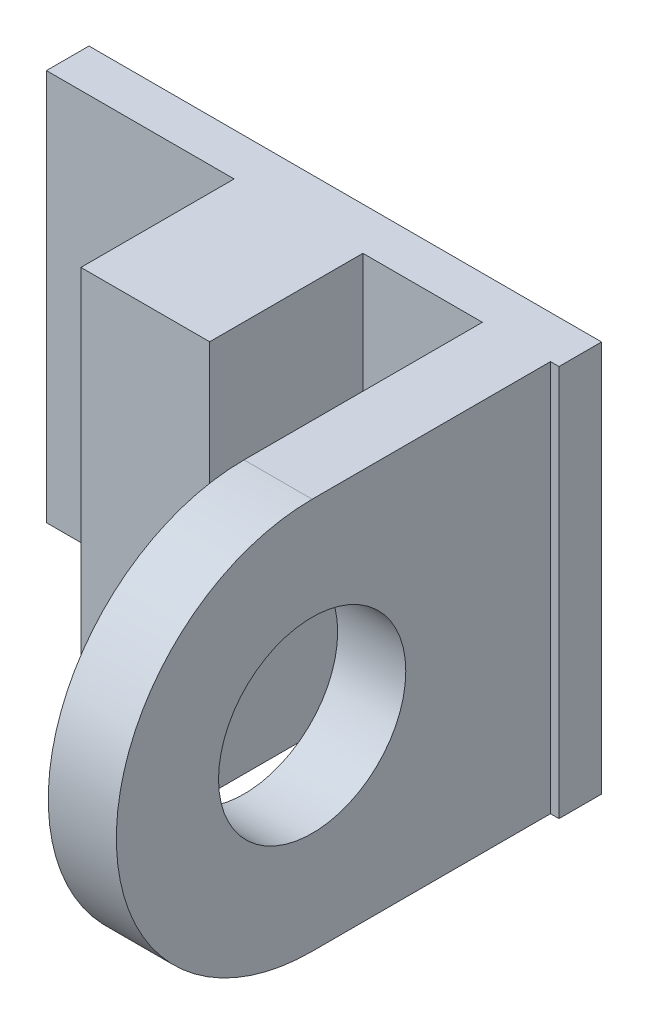
ISO-10303-21;
HEADER;
FILE_DESCRIPTION(('STEP AP214'),'2;1');
FILE_NAME('part.step','',(''),(''),'','','');
FILE_SCHEMA(('AUTOMOTIVE_DESIGN { 1 0 10303 214 1 1 1 1 }'));
ENDSEC;
DATA;
#1=APPLICATION_CONTEXT('core data for automotive mechanical design processes');
#2=APPLICATION_PROTOCOL_DEFINITION('international standard','automotive_design',2000,#1);
#3=PRODUCT_CONTEXT('',#1,'mechanical');
#4=PRODUCT('Part','Part','',(#3));
#5=PRODUCT_RELATED_PRODUCT_CATEGORY('part','',(#4));
#6=PRODUCT_DEFINITION_FORMATION('','',#4);
#7=PRODUCT_DEFINITION_CONTEXT('part definition',#1,'design');
#8=PRODUCT_DEFINITION('design','',#6,#7);
#9=PRODUCT_DEFINITION_SHAPE('','',#8);
#10=(LENGTH_UNIT() NAMED_UNIT(*) SI_UNIT(.MILLI.,.METRE.));
#11=(NAMED_UNIT(*) PLANE_ANGLE_UNIT() SI_UNIT($,.RADIAN.));
#12=(NAMED_UNIT(*) SI_UNIT($,.STERADIAN.) SOLID_ANGLE_UNIT());
#13=UNCERTAINTY_MEASURE_WITH_UNIT(LENGTH_MEASURE(1.E-05),#10,'distance_accuracy_value','');
#14=(GEOMETRIC_REPRESENTATION_CONTEXT(3) GLOBAL_UNCERTAINTY_ASSIGNED_CONTEXT((#13)) GLOBAL_UNIT_ASSIGNED_CONTEXT((#10,
#11,#12)) REPRESENTATION_CONTEXT('',''));
#15=CARTESIAN_POINT('',(0.,0.,0.));
#16=DIRECTION('',(0.,0.,1.));
#17=DIRECTION('',(1.,0.,0.));
#18=AXIS2_PLACEMENT_3D('',#15,#16,#17);
#19=CARTESIAN_POINT('',(0.,0.,5.));
#20=DIRECTION('',(0.,0.,-1.));
#21=DIRECTION('',(-1.,0.,0.));
#22=AXIS2_PLACEMENT_3D('',#19,#20,#21);
#23=PLANE('',#22);
#24=DIRECTION('',(0.,1.,0.));
#25=VECTOR('',#24,1.);
#26=CARTESIAN_POINT('',(13.,-23.,5.));
#27=LINE('',#26,#25);
#28=CARTESIAN_POINT('',(13.,-23.,5.));
#29=VERTEX_POINT('',#28);
#30=CARTESIAN_POINT('',(13.,23.,5.));
#31=VERTEX_POINT('',#30);
#32=EDGE_CURVE('E172',#29,#31,#27,.T.);
#33=ORIENTED_EDGE('',*,*,#32,.F.);
#34=DIRECTION('',(1.,0.,0.));
#35=VECTOR('',#34,1.);
#36=CARTESIAN_POINT('',(-46.2139933235213,-23.,5.));
#37=LINE('',#36,#35);
#38=CARTESIAN_POINT('',(14.,-23.,5.));
#39=VERTEX_POINT('',#38);
#40=EDGE_CURVE('E205',#29,#39,#37,.T.);
#41=ORIENTED_EDGE('',*,*,#40,.T.);
#42=DIRECTION('',(0.,1.,0.));
#43=VECTOR('',#42,1.);
#44=CARTESIAN_POINT('',(14.,-23.,5.));
#45=LINE('',#44,#43);
#46=CARTESIAN_POINT('',(14.,23.,5.));
#47=VERTEX_POINT('',#46);
#48=EDGE_CURVE('E198',#39,#47,#45,.T.);
#49=ORIENTED_EDGE('',*,*,#48,.T.);
#50=DIRECTION('',(-1.,0.,0.));
#51=VECTOR('',#50,1.);
#52=CARTESIAN_POINT('',(-46.2139933235213,23.,5.));
#53=LINE('',#52,#51);
#54=EDGE_CURVE('E56',#47,#31,#53,.T.);
#55=ORIENTED_EDGE('',*,*,#54,.T.);
#56=EDGE_LOOP('',(#33,#41,#49,#55));
#57=FACE_BOUND('',#56,.T.);
#58=ADVANCED_FACE('F33',(#57),#23,.F.);
#59=DIRECTION('',(0.,-1.,0.));
#60=VECTOR('',#59,1.);
#61=CARTESIAN_POINT('',(5.,-23.,5.));
#62=LINE('',#61,#60);
#63=CARTESIAN_POINT('',(5.,23.,5.));
#64=VERTEX_POINT('',#63);
#65=CARTESIAN_POINT('',(5.,-23.,5.));
#66=VERTEX_POINT('',#65);
#67=EDGE_CURVE('E48',#64,#66,#62,.T.);
#68=ORIENTED_EDGE('',*,*,#67,.F.);
#69=CARTESIAN_POINT('',(-9.03790020483503,23.,5.));
#70=VERTEX_POINT('',#69);
#71=EDGE_CURVE('E203',#64,#70,#53,.T.);
#72=ORIENTED_EDGE('',*,*,#71,.T.);
#73=DIRECTION('',(0.,1.,0.));
#74=VECTOR('',#73,1.);
#75=CARTESIAN_POINT('',(-9.03790020483503,-23.,5.));
#76=LINE('',#75,#74);
#77=CARTESIAN_POINT('',(-9.03790020483503,-23.,5.));
#78=VERTEX_POINT('',#77);
#79=EDGE_CURVE('E187',#78,#70,#76,.T.);
#80=ORIENTED_EDGE('',*,*,#79,.F.);
#81=EDGE_CURVE('E209',#78,#66,#37,.T.);
#82=ORIENTED_EDGE('',*,*,#81,.T.);
#83=EDGE_LOOP('',(#68,#72,#80,#82));
#84=FACE_BOUND('',#83,.T.);
#85=ADVANCED_FACE('F239',(#84),#23,.F.);
#86=DIRECTION('',(0.,-1.,0.));
#87=VECTOR('',#86,1.);
#88=CARTESIAN_POINT('',(-24.1641293147936,-23.,5.));
#89=LINE('',#88,#87);
#90=CARTESIAN_POINT('',(-24.1641293147936,23.,5.));
#91=VERTEX_POINT('',#90);
#92=CARTESIAN_POINT('',(-24.1641293147936,-23.,5.));
#93=VERTEX_POINT('',#92);
#94=EDGE_CURVE('E190',#91,#93,#89,.T.);
#95=ORIENTED_EDGE('',*,*,#94,.F.);
#96=CARTESIAN_POINT('',(-46.2139933235213,23.,5.));
#97=VERTEX_POINT('',#96);
#98=EDGE_CURVE('E130',#91,#97,#53,.T.);
#99=ORIENTED_EDGE('',*,*,#98,.T.);
#100=DIRECTION('',(0.,-1.,0.));
#101=VECTOR('',#100,1.);
#102=CARTESIAN_POINT('',(-46.2139933235213,-23.,5.));
#103=LINE('',#102,#101);
#104=CARTESIAN_POINT('',(-46.2139933235213,-23.,5.));
#105=VERTEX_POINT('',#104);
#106=EDGE_CURVE('E202',#97,#105,#103,.T.);
#107=ORIENTED_EDGE('',*,*,#106,.T.);
#108=EDGE_CURVE('E206',#105,#93,#37,.T.);
#109=ORIENTED_EDGE('',*,*,#108,.T.);
#110=EDGE_LOOP('',(#95,#99,#107,#109));
#111=FACE_BOUND('',#110,.T.);
#112=ADVANCED_FACE('F250',(#111),#23,.F.);
#113=CARTESIAN_POINT('',(14.,-23.,5.));
#114=DIRECTION('',(-1.,0.,0.));
#115=DIRECTION('',(0.,-1.,0.));
#116=AXIS2_PLACEMENT_3D('',#113,#114,#115);
#117=PLANE('',#116);
#118=DIRECTION('',(0.,1.,0.));
#119=VECTOR('',#118,1.);
#120=CARTESIAN_POINT('',(14.,-23.,0.));
#121=LINE('',#120,#119);
#122=CARTESIAN_POINT('',(14.,-23.,0.));
#123=VERTEX_POINT('',#122);
#124=CARTESIAN_POINT('',(14.,23.,0.));
#125=VERTEX_POINT('',#124);
#126=EDGE_CURVE('E197',#123,#125,#121,.T.);
#127=ORIENTED_EDGE('',*,*,#126,.T.);
#128=DIRECTION('',(0.,0.,-1.));
#129=VECTOR('',#128,1.);
#130=CARTESIAN_POINT('',(14.,23.,5.));
#131=LINE('',#130,#129);
#132=EDGE_CURVE('E11',#47,#125,#131,.T.);
#133=ORIENTED_EDGE('',*,*,#132,.F.);
#134=ORIENTED_EDGE('',*,*,#48,.F.);
#135=DIRECTION('',(0.,0.,-1.));
#136=VECTOR('',#135,1.);
#137=CARTESIAN_POINT('',(14.,-23.,5.));
#138=LINE('',#137,#136);
#139=EDGE_CURVE('E208',#39,#123,#138,.T.);
#140=ORIENTED_EDGE('',*,*,#139,.T.);
#141=EDGE_LOOP('',(#127,#133,#134,#140));
#142=FACE_BOUND('',#141,.T.);
#143=ADVANCED_FACE('F35',(#142),#117,.F.);
#144=CARTESIAN_POINT('',(-46.2139933235213,23.,5.));
#145=DIRECTION('',(0.,-1.,0.));
#146=DIRECTION('',(0.,0.,-1.));
#147=AXIS2_PLACEMENT_3D('',#144,#145,#146);
#148=PLANE('',#147);
#149=DIRECTION('',(-1.,0.,0.));
#150=VECTOR('',#149,1.);
#151=CARTESIAN_POINT('',(-46.2139933235213,23.,0.));
#152=LINE('',#151,#150);
#153=CARTESIAN_POINT('',(-46.2139933235213,23.,0.));
#154=VERTEX_POINT('',#153);
#155=EDGE_CURVE('E212',#125,#154,#152,.T.);
#156=ORIENTED_EDGE('',*,*,#155,.T.);
#157=DIRECTION('',(0.,0.,-1.));
#158=VECTOR('',#157,1.);
#159=CARTESIAN_POINT('',(-46.2139933235213,23.,5.));
#160=LINE('',#159,#158);
#161=EDGE_CURVE('E41',#97,#154,#160,.T.);
#162=ORIENTED_EDGE('',*,*,#161,.F.);
#163=ORIENTED_EDGE('',*,*,#98,.F.);
#164=DIRECTION('',(0.,0.,-1.));
#165=VECTOR('',#164,1.);
#166=CARTESIAN_POINT('',(-24.1641293147936,23.,11.));
#167=LINE('',#166,#165);
#168=CARTESIAN_POINT('',(-24.1641293147936,23.,23.));
#169=VERTEX_POINT('',#168);
#170=EDGE_CURVE('E124',#169,#91,#167,.T.);
#171=ORIENTED_EDGE('',*,*,#170,.F.);
#172=DIRECTION('',(-1.,0.,0.));
#173=VECTOR('',#172,1.);
#174=CARTESIAN_POINT('',(38.5015570911838,23.,23.));
#175=LINE('',#174,#173);
#176=CARTESIAN_POINT('',(-9.03790020483503,23.,23.));
#177=VERTEX_POINT('',#176);
#178=EDGE_CURVE('E128',#177,#169,#175,.T.);
#179=ORIENTED_EDGE('',*,*,#178,.F.);
#180=DIRECTION('',(0.,0.,-1.));
#181=VECTOR('',#180,1.);
#182=CARTESIAN_POINT('',(-9.03790020483503,23.,11.));
#183=LINE('',#182,#181);
#184=EDGE_CURVE('E134',#177,#70,#183,.T.);
#185=ORIENTED_EDGE('',*,*,#184,.T.);
#186=ORIENTED_EDGE('',*,*,#71,.F.);
#187=DIRECTION('',(0.,0.,-1.));
#188=VECTOR('',#187,1.);
#189=CARTESIAN_POINT('',(5.,23.,11.));
#190=LINE('',#189,#188);
#191=CARTESIAN_POINT('',(5.,23.,33.));
#192=VERTEX_POINT('',#191);
#193=EDGE_CURVE('E182',#192,#64,#190,.T.);
#194=ORIENTED_EDGE('',*,*,#193,.F.);
#195=DIRECTION('',(-1.,0.,0.));
#196=VECTOR('',#195,1.);
#197=CARTESIAN_POINT('',(77.3506021727847,23.,33.));
#198=LINE('',#197,#196);
#199=CARTESIAN_POINT('',(13.,23.,33.));
#200=VERTEX_POINT('',#199);
#201=EDGE_CURVE('E158',#200,#192,#198,.T.);
#202=ORIENTED_EDGE('',*,*,#201,.F.);
#203=DIRECTION('',(0.,0.,-1.));
#204=VECTOR('',#203,1.);
#205=CARTESIAN_POINT('',(13.,23.,11.));
#206=LINE('',#205,#204);
#207=EDGE_CURVE('E185',#200,#31,#206,.T.);
#208=ORIENTED_EDGE('',*,*,#207,.T.);
#209=ORIENTED_EDGE('',*,*,#54,.F.);
#210=ORIENTED_EDGE('',*,*,#132,.T.);
#211=EDGE_LOOP('',(#156,#162,#163,#171,#179,#185,#186,#194,#202,#208,#209,#210));
#212=FACE_BOUND('',#211,.T.);
#213=ADVANCED_FACE('F126',(#212),#148,.F.);
#214=CARTESIAN_POINT('',(-46.2139933235213,-23.,5.));
#215=DIRECTION('',(1.,0.,0.));
#216=DIRECTION('',(0.,0.,-1.));
#217=AXIS2_PLACEMENT_3D('',#214,#215,#216);
#218=PLANE('',#217);
#219=DIRECTION('',(0.,-1.,0.));
#220=VECTOR('',#219,1.);
#221=CARTESIAN_POINT('',(-46.2139933235213,-23.,0.));
#222=LINE('',#221,#220);
#223=CARTESIAN_POINT('',(-46.2139933235213,-23.,0.));
#224=VERTEX_POINT('',#223);
#225=EDGE_CURVE('E214',#154,#224,#222,.T.);
#226=ORIENTED_EDGE('',*,*,#225,.T.);
#227=DIRECTION('',(0.,0.,-1.));
#228=VECTOR('',#227,1.);
#229=CARTESIAN_POINT('',(-46.2139933235213,-23.,5.));
#230=LINE('',#229,#228);
#231=EDGE_CURVE('E219',#105,#224,#230,.T.);
#232=ORIENTED_EDGE('',*,*,#231,.F.);
#233=ORIENTED_EDGE('',*,*,#106,.F.);
#234=ORIENTED_EDGE('',*,*,#161,.T.);
#235=EDGE_LOOP('',(#226,#232,#233,#234));
#236=FACE_BOUND('',#235,.T.);
#237=ADVANCED_FACE('F225',(#236),#218,.F.);
#238=CARTESIAN_POINT('',(-46.2139933235213,-23.,5.));
#239=DIRECTION('',(0.,1.,0.));
#240=DIRECTION('',(0.,0.,1.));
#241=AXIS2_PLACEMENT_3D('',#238,#239,#240);
#242=PLANE('',#241);
#243=DIRECTION('',(1.,0.,0.));
#244=VECTOR('',#243,1.);
#245=CARTESIAN_POINT('',(-46.2139933235213,-23.,0.));
#246=LINE('',#245,#244);
#247=EDGE_CURVE('E200',#224,#123,#246,.T.);
#248=ORIENTED_EDGE('',*,*,#247,.T.);
#249=ORIENTED_EDGE('',*,*,#139,.F.);
#250=ORIENTED_EDGE('',*,*,#40,.F.);
#251=DIRECTION('',(0.,0.,-1.));
#252=VECTOR('',#251,1.);
#253=CARTESIAN_POINT('',(13.,-23.,11.));
#254=LINE('',#253,#252);
#255=CARTESIAN_POINT('',(13.,-23.,33.));
#256=VERTEX_POINT('',#255);
#257=EDGE_CURVE('E176',#256,#29,#254,.T.);
#258=ORIENTED_EDGE('',*,*,#257,.F.);
#259=DIRECTION('',(-1.,0.,0.));
#260=VECTOR('',#259,1.);
#261=CARTESIAN_POINT('',(77.3506021727847,-23.,33.));
#262=LINE('',#261,#260);
#263=CARTESIAN_POINT('',(5.,-23.,33.));
#264=VERTEX_POINT('',#263);
#265=EDGE_CURVE('E165',#256,#264,#262,.T.);
#266=ORIENTED_EDGE('',*,*,#265,.T.);
#267=DIRECTION('',(0.,0.,-1.));
#268=VECTOR('',#267,1.);
#269=CARTESIAN_POINT('',(5.,-23.,11.));
#270=LINE('',#269,#268);
#271=EDGE_CURVE('E179',#264,#66,#270,.T.);
#272=ORIENTED_EDGE('',*,*,#271,.T.);
#273=ORIENTED_EDGE('',*,*,#81,.F.);
#274=DIRECTION('',(0.,0.,-1.));
#275=VECTOR('',#274,1.);
#276=CARTESIAN_POINT('',(-9.03790020483503,-23.,11.));
#277=LINE('',#276,#275);
#278=CARTESIAN_POINT('',(-9.03790020483503,-23.,23.));
#279=VERTEX_POINT('',#278);
#280=EDGE_CURVE('E192',#279,#78,#277,.T.);
#281=ORIENTED_EDGE('',*,*,#280,.F.);
#282=DIRECTION('',(-1.,0.,0.));
#283=VECTOR('',#282,1.);
#284=CARTESIAN_POINT('',(38.5015570911838,-23.,23.));
#285=LINE('',#284,#283);
#286=CARTESIAN_POINT('',(-24.1641293147936,-23.,23.));
#287=VERTEX_POINT('',#286);
#288=EDGE_CURVE('E145',#279,#287,#285,.T.);
#289=ORIENTED_EDGE('',*,*,#288,.T.);
#290=DIRECTION('',(0.,0.,-1.));
#291=VECTOR('',#290,1.);
#292=CARTESIAN_POINT('',(-24.1641293147936,-23.,11.));
#293=LINE('',#292,#291);
#294=EDGE_CURVE('E135',#287,#93,#293,.T.);
#295=ORIENTED_EDGE('',*,*,#294,.T.);
#296=ORIENTED_EDGE('',*,*,#108,.F.);
#297=ORIENTED_EDGE('',*,*,#231,.T.);
#298=EDGE_LOOP('',(#248,#249,#250,#258,#266,#272,#273,#281,#289,#295,#296,#297));
#299=FACE_BOUND('',#298,.T.);
#300=ADVANCED_FACE('F233',(#299),#242,.F.);
#301=CARTESIAN_POINT('',(0.,0.,0.));
#302=DIRECTION('',(0.,0.,-1.));
#303=DIRECTION('',(-1.,0.,0.));
#304=AXIS2_PLACEMENT_3D('',#301,#302,#303);
#305=PLANE('',#304);
#306=ORIENTED_EDGE('',*,*,#126,.F.);
#307=ORIENTED_EDGE('',*,*,#247,.F.);
#308=ORIENTED_EDGE('',*,*,#225,.F.);
#309=ORIENTED_EDGE('',*,*,#155,.F.);
#310=EDGE_LOOP('',(#306,#307,#308,#309));
#311=FACE_BOUND('',#310,.T.);
#312=ADVANCED_FACE('F230',(#311),#305,.T.);
#313=CARTESIAN_POINT('',(-9.03790020483503,-23.,11.));
#314=DIRECTION('',(-1.,0.,0.));
#315=DIRECTION('',(0.,0.,1.));
#316=AXIS2_PLACEMENT_3D('',#313,#314,#315);
#317=PLANE('',#316);
#318=ORIENTED_EDGE('',*,*,#79,.T.);
#319=ORIENTED_EDGE('',*,*,#184,.F.);
#320=DIRECTION('',(0.,1.,0.));
#321=VECTOR('',#320,1.);
#322=CARTESIAN_POINT('',(-9.03790020483503,23.,23.));
#323=LINE('',#322,#321);
#324=EDGE_CURVE('E144',#279,#177,#323,.T.);
#325=ORIENTED_EDGE('',*,*,#324,.F.);
#326=ORIENTED_EDGE('',*,*,#280,.T.);
#327=EDGE_LOOP('',(#318,#319,#325,#326));
#328=FACE_BOUND('',#327,.T.);
#329=ADVANCED_FACE('F252',(#328),#317,.F.);
#330=CARTESIAN_POINT('',(-24.1641293147936,-23.,11.));
#331=DIRECTION('',(1.,0.,0.));
#332=DIRECTION('',(0.,0.,-1.));
#333=AXIS2_PLACEMENT_3D('',#330,#331,#332);
#334=PLANE('',#333);
#335=ORIENTED_EDGE('',*,*,#94,.T.);
#336=ORIENTED_EDGE('',*,*,#294,.F.);
#337=DIRECTION('',(0.,-1.,0.));
#338=VECTOR('',#337,1.);
#339=CARTESIAN_POINT('',(-24.1641293147936,23.,23.));
#340=LINE('',#339,#338);
#341=EDGE_CURVE('E142',#169,#287,#340,.T.);
#342=ORIENTED_EDGE('',*,*,#341,.F.);
#343=ORIENTED_EDGE('',*,*,#170,.T.);
#344=EDGE_LOOP('',(#335,#336,#342,#343));
#345=FACE_BOUND('',#344,.T.);
#346=ADVANCED_FACE('F147',(#345),#334,.F.);
#347=CARTESIAN_POINT('',(13.,-23.,11.));
#348=DIRECTION('',(-1.,0.,0.));
#349=DIRECTION('',(0.,0.,1.));
#350=AXIS2_PLACEMENT_3D('',#347,#348,#349);
#351=PLANE('',#350);
#352=ORIENTED_EDGE('',*,*,#32,.T.);
#353=ORIENTED_EDGE('',*,*,#207,.F.);
#354=CARTESIAN_POINT('',(13.,0.,33.));
#355=DIRECTION('',(-1.,0.,0.));
#356=DIRECTION('',(0.,0.,1.));
#357=AXIS2_PLACEMENT_3D('',#354,#355,#356);
#358=CIRCLE('',#357,23.);
#359=EDGE_CURVE('E154',#200,#256,#358,.F.);
#360=ORIENTED_EDGE('',*,*,#359,.T.);
#361=ORIENTED_EDGE('',*,*,#257,.T.);
#362=EDGE_LOOP('',(#352,#353,#360,#361));
#363=FACE_BOUND('',#362,.T.);
#364=CARTESIAN_POINT('',(13.,0.,33.));
#365=DIRECTION('',(-1.,0.,0.));
#366=DIRECTION('',(0.,0.,1.));
#367=AXIS2_PLACEMENT_3D('',#364,#365,#366);
#368=CIRCLE('',#367,11.);
#369=CARTESIAN_POINT('',(13.,0.,44.));
#370=VERTEX_POINT('',#369);
#371=EDGE_CURVE('E157',#370,#370,#368,.F.);
#372=ORIENTED_EDGE('',*,*,#371,.F.);
#373=EDGE_LOOP('',(#372));
#374=FACE_BOUND('',#373,.T.);
#375=ADVANCED_FACE('F259',(#363,#374),#351,.F.);
#376=CARTESIAN_POINT('',(5.,-23.,11.));
#377=DIRECTION('',(1.,0.,0.));
#378=DIRECTION('',(0.,1.,0.));
#379=AXIS2_PLACEMENT_3D('',#376,#377,#378);
#380=PLANE('',#379);
#381=ORIENTED_EDGE('',*,*,#67,.T.);
#382=ORIENTED_EDGE('',*,*,#271,.F.);
#383=CARTESIAN_POINT('',(5.,0.,33.));
#384=DIRECTION('',(-1.,0.,0.));
#385=DIRECTION('',(0.,0.,1.));
#386=AXIS2_PLACEMENT_3D('',#383,#384,#385);
#387=CIRCLE('',#386,23.);
#388=EDGE_CURVE('E162',#264,#192,#387,.T.);
#389=ORIENTED_EDGE('',*,*,#388,.T.);
#390=ORIENTED_EDGE('',*,*,#193,.T.);
#391=EDGE_LOOP('',(#381,#382,#389,#390));
#392=FACE_BOUND('',#391,.T.);
#393=CARTESIAN_POINT('',(5.,0.,33.));
#394=DIRECTION('',(-1.,0.,0.));
#395=DIRECTION('',(0.,0.,1.));
#396=AXIS2_PLACEMENT_3D('',#393,#394,#395);
#397=CIRCLE('',#396,11.);
#398=CARTESIAN_POINT('',(5.,0.,44.));
#399=VERTEX_POINT('',#398);
#400=EDGE_CURVE('E159',#399,#399,#397,.T.);
#401=ORIENTED_EDGE('',*,*,#400,.F.);
#402=EDGE_LOOP('',(#401));
#403=FACE_BOUND('',#402,.T.);
#404=ADVANCED_FACE('F241',(#392,#403),#380,.F.);
#405=CARTESIAN_POINT('',(77.3506021727847,0.,33.));
#406=DIRECTION('',(-1.,0.,0.));
#407=DIRECTION('',(0.,0.,1.));
#408=AXIS2_PLACEMENT_3D('',#405,#406,#407);
#409=CYLINDRICAL_SURFACE('',#408,23.);
#410=ORIENTED_EDGE('',*,*,#359,.F.);
#411=ORIENTED_EDGE('',*,*,#201,.T.);
#412=ORIENTED_EDGE('',*,*,#388,.F.);
#413=ORIENTED_EDGE('',*,*,#265,.F.);
#414=EDGE_LOOP('',(#410,#411,#412,#413));
#415=FACE_BOUND('',#414,.T.);
#416=ADVANCED_FACE('F247',(#415),#409,.T.);
#417=CARTESIAN_POINT('',(77.3506021727847,0.,33.));
#418=DIRECTION('',(-1.,0.,0.));
#419=DIRECTION('',(0.,0.,1.));
#420=AXIS2_PLACEMENT_3D('',#417,#418,#419);
#421=CYLINDRICAL_SURFACE('',#420,11.);
#422=ORIENTED_EDGE('',*,*,#371,.T.);
#423=EDGE_LOOP('',(#422));
#424=FACE_BOUND('',#423,.T.);
#425=ORIENTED_EDGE('',*,*,#400,.T.);
#426=EDGE_LOOP('',(#425));
#427=FACE_BOUND('',#426,.T.);
#428=ADVANCED_FACE('F335',(#424,#427),#421,.F.);
#429=CARTESIAN_POINT('',(38.5015570911838,23.,23.));
#430=DIRECTION('',(0.,0.,-1.));
#431=DIRECTION('',(0.,1.,0.));
#432=AXIS2_PLACEMENT_3D('',#429,#430,#431);
#433=PLANE('',#432);
#434=ORIENTED_EDGE('',*,*,#288,.F.);
#435=ORIENTED_EDGE('',*,*,#324,.T.);
#436=ORIENTED_EDGE('',*,*,#178,.T.);
#437=ORIENTED_EDGE('',*,*,#341,.T.);
#438=EDGE_LOOP('',(#434,#435,#436,#437));
#439=FACE_BOUND('',#438,.T.);
#440=ADVANCED_FACE('F141',(#439),#433,.F.);
#441=CLOSED_SHELL('',(#58,#85,#112,#143,#213,#237,#300,#312,#329,#346,#375,#404,#416,#428,#440));
#442=MANIFOLD_SOLID_BREP('B2',#441);
#443=ADVANCED_BREP_SHAPE_REPRESENTATION('',(#18,#442),#14);
#444=SHAPE_DEFINITION_REPRESENTATION(#9,#443);
ENDSEC;
END-ISO-10303-21;
